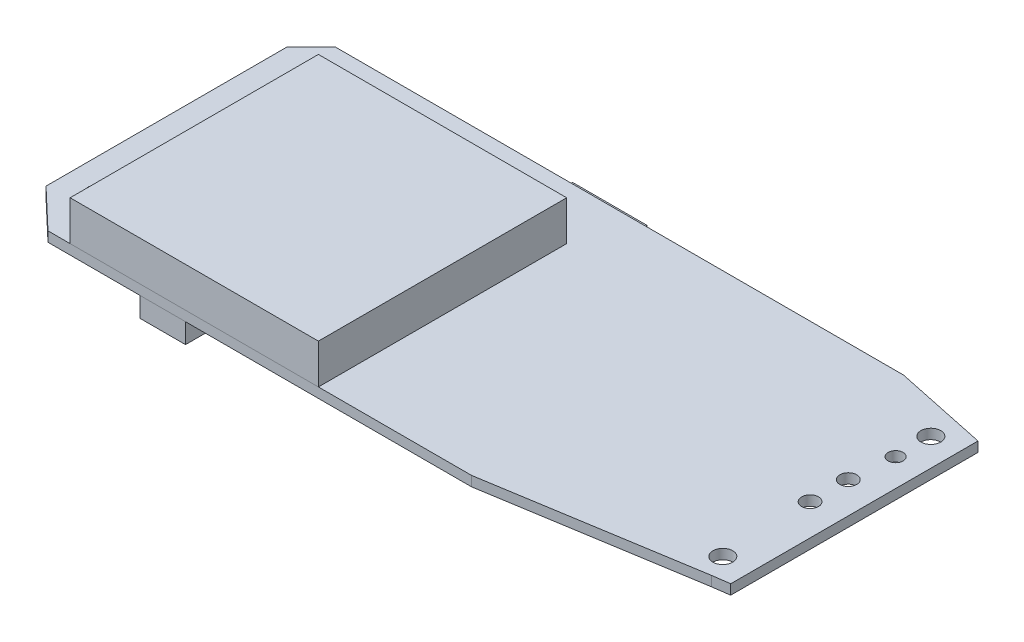
ISO-10303-21;
HEADER;
FILE_DESCRIPTION(('STEP AP214'),'2;1');
FILE_NAME('part.step','',(''),(''),'','','');
FILE_SCHEMA(('AUTOMOTIVE_DESIGN { 1 0 10303 214 1 1 1 1 }'));
ENDSEC;
DATA;
#1=APPLICATION_CONTEXT('core data for automotive mechanical design processes');
#2=APPLICATION_PROTOCOL_DEFINITION('international standard','automotive_design',2000,#1);
#3=PRODUCT_CONTEXT('',#1,'mechanical');
#4=PRODUCT('Part','Part','',(#3));
#5=PRODUCT_RELATED_PRODUCT_CATEGORY('part','',(#4));
#6=PRODUCT_DEFINITION_FORMATION('','',#4);
#7=PRODUCT_DEFINITION_CONTEXT('part definition',#1,'design');
#8=PRODUCT_DEFINITION('design','',#6,#7);
#9=PRODUCT_DEFINITION_SHAPE('','',#8);
#10=(LENGTH_UNIT() NAMED_UNIT(*) SI_UNIT(.MILLI.,.METRE.));
#11=(NAMED_UNIT(*) PLANE_ANGLE_UNIT() SI_UNIT($,.RADIAN.));
#12=(NAMED_UNIT(*) SI_UNIT($,.STERADIAN.) SOLID_ANGLE_UNIT());
#13=UNCERTAINTY_MEASURE_WITH_UNIT(LENGTH_MEASURE(1.E-05),#10,'distance_accuracy_value','');
#14=(GEOMETRIC_REPRESENTATION_CONTEXT(3) GLOBAL_UNCERTAINTY_ASSIGNED_CONTEXT((#13)) GLOBAL_UNIT_ASSIGNED_CONTEXT((#10,
#11,#12)) REPRESENTATION_CONTEXT('',''));
#15=CARTESIAN_POINT('',(0.,0.,0.));
#16=DIRECTION('',(0.,0.,1.));
#17=DIRECTION('',(1.,0.,0.));
#18=AXIS2_PLACEMENT_3D('',#15,#16,#17);
#19=CARTESIAN_POINT('',(-16.725,-2.,15.25));
#20=DIRECTION('',(-1.,0.,0.));
#21=DIRECTION('',(0.,0.,1.));
#22=AXIS2_PLACEMENT_3D('',#19,#20,#21);
#23=PLANE('',#22);
#24=DIRECTION('',(0.,0.,1.));
#25=VECTOR('',#24,1.);
#26=CARTESIAN_POINT('',(-16.725,0.,15.25));
#27=LINE('',#26,#25);
#28=CARTESIAN_POINT('',(-16.725,0.,12.85));
#29=VERTEX_POINT('',#28);
#30=CARTESIAN_POINT('',(-16.725,0.,15.25));
#31=VERTEX_POINT('',#30);
#32=EDGE_CURVE('E109',#29,#31,#27,.T.);
#33=ORIENTED_EDGE('',*,*,#32,.T.);
#34=DIRECTION('',(0.,1.,0.));
#35=VECTOR('',#34,1.);
#36=CARTESIAN_POINT('',(-16.725,-2.,15.25));
#37=LINE('',#36,#35);
#38=CARTESIAN_POINT('',(-16.725,-2.,15.25));
#39=VERTEX_POINT('',#38);
#40=EDGE_CURVE('E12',#39,#31,#37,.T.);
#41=ORIENTED_EDGE('',*,*,#40,.F.);
#42=DIRECTION('',(0.,0.,1.));
#43=VECTOR('',#42,1.);
#44=CARTESIAN_POINT('',(-16.725,-2.,15.25));
#45=LINE('',#44,#43);
#46=CARTESIAN_POINT('',(-16.725,-2.,12.85));
#47=VERTEX_POINT('',#46);
#48=EDGE_CURVE('E97',#47,#39,#45,.T.);
#49=ORIENTED_EDGE('',*,*,#48,.F.);
#50=DIRECTION('',(0.,1.,0.));
#51=VECTOR('',#50,1.);
#52=CARTESIAN_POINT('',(-16.725,-2.,12.85));
#53=LINE('',#52,#51);
#54=EDGE_CURVE('E105',#47,#29,#53,.T.);
#55=ORIENTED_EDGE('',*,*,#54,.T.);
#56=EDGE_LOOP('',(#33,#41,#49,#55));
#57=FACE_BOUND('',#56,.T.);
#58=ADVANCED_FACE('F46',(#57),#23,.F.);
#59=CARTESIAN_POINT('',(-21.285,-2.,15.25));
#60=DIRECTION('',(0.,0.,-1.));
#61=DIRECTION('',(-1.,0.,0.));
#62=AXIS2_PLACEMENT_3D('',#59,#60,#61);
#63=PLANE('',#62);
#64=DIRECTION('',(-1.,0.,0.));
#65=VECTOR('',#64,1.);
#66=CARTESIAN_POINT('',(-21.285,0.,15.25));
#67=LINE('',#66,#65);
#68=CARTESIAN_POINT('',(-21.285,0.,15.25));
#69=VERTEX_POINT('',#68);
#70=EDGE_CURVE('E101',#31,#69,#67,.T.);
#71=ORIENTED_EDGE('',*,*,#70,.T.);
#72=DIRECTION('',(0.,1.,0.));
#73=VECTOR('',#72,1.);
#74=CARTESIAN_POINT('',(-21.285,-2.,15.25));
#75=LINE('',#74,#73);
#76=CARTESIAN_POINT('',(-21.285,-2.,15.25));
#77=VERTEX_POINT('',#76);
#78=EDGE_CURVE('E54',#77,#69,#75,.T.);
#79=ORIENTED_EDGE('',*,*,#78,.F.);
#80=DIRECTION('',(-1.,0.,0.));
#81=VECTOR('',#80,1.);
#82=CARTESIAN_POINT('',(-21.285,-2.,15.25));
#83=LINE('',#82,#81);
#84=EDGE_CURVE('E92',#39,#77,#83,.T.);
#85=ORIENTED_EDGE('',*,*,#84,.F.);
#86=ORIENTED_EDGE('',*,*,#40,.T.);
#87=EDGE_LOOP('',(#71,#79,#85,#86));
#88=FACE_BOUND('',#87,.T.);
#89=ADVANCED_FACE('F100',(#88),#63,.F.);
#90=CARTESIAN_POINT('',(-21.285,-2.,15.25));
#91=DIRECTION('',(1.,0.,0.));
#92=DIRECTION('',(0.,0.,-1.));
#93=AXIS2_PLACEMENT_3D('',#90,#91,#92);
#94=PLANE('',#93);
#95=DIRECTION('',(0.,0.,-1.));
#96=VECTOR('',#95,1.);
#97=CARTESIAN_POINT('',(-21.285,0.,15.25));
#98=LINE('',#97,#96);
#99=CARTESIAN_POINT('',(-21.285,0.,12.85));
#100=VERTEX_POINT('',#99);
#101=EDGE_CURVE('E79',#69,#100,#98,.T.);
#102=ORIENTED_EDGE('',*,*,#101,.T.);
#103=DIRECTION('',(0.,1.,0.));
#104=VECTOR('',#103,1.);
#105=CARTESIAN_POINT('',(-21.285,-2.,12.85));
#106=LINE('',#105,#104);
#107=CARTESIAN_POINT('',(-21.285,-2.,12.85));
#108=VERTEX_POINT('',#107);
#109=EDGE_CURVE('E102',#108,#100,#106,.T.);
#110=ORIENTED_EDGE('',*,*,#109,.F.);
#111=DIRECTION('',(0.,0.,-1.));
#112=VECTOR('',#111,1.);
#113=CARTESIAN_POINT('',(-21.285,-2.,15.25));
#114=LINE('',#113,#112);
#115=EDGE_CURVE('E95',#77,#108,#114,.T.);
#116=ORIENTED_EDGE('',*,*,#115,.F.);
#117=ORIENTED_EDGE('',*,*,#78,.T.);
#118=EDGE_LOOP('',(#102,#110,#116,#117));
#119=FACE_BOUND('',#118,.T.);
#120=ADVANCED_FACE('F103',(#119),#94,.F.);
#121=CARTESIAN_POINT('',(-21.285,-2.,12.85));
#122=DIRECTION('',(0.,0.,1.));
#123=DIRECTION('',(1.,0.,0.));
#124=AXIS2_PLACEMENT_3D('',#121,#122,#123);
#125=PLANE('',#124);
#126=DIRECTION('',(1.,0.,0.));
#127=VECTOR('',#126,1.);
#128=CARTESIAN_POINT('',(-21.285,0.,12.85));
#129=LINE('',#128,#127);
#130=EDGE_CURVE('E85',#100,#29,#129,.T.);
#131=ORIENTED_EDGE('',*,*,#130,.T.);
#132=ORIENTED_EDGE('',*,*,#54,.F.);
#133=DIRECTION('',(1.,0.,0.));
#134=VECTOR('',#133,1.);
#135=CARTESIAN_POINT('',(-21.285,-2.,12.85));
#136=LINE('',#135,#134);
#137=EDGE_CURVE('E62',#108,#47,#136,.T.);
#138=ORIENTED_EDGE('',*,*,#137,.F.);
#139=ORIENTED_EDGE('',*,*,#109,.T.);
#140=EDGE_LOOP('',(#131,#132,#138,#139));
#141=FACE_BOUND('',#140,.T.);
#142=ADVANCED_FACE('F116',(#141),#125,.F.);
#143=CARTESIAN_POINT('',(0.,-2.,0.));
#144=DIRECTION('',(0.,-1.,0.));
#145=DIRECTION('',(0.,0.,-1.));
#146=AXIS2_PLACEMENT_3D('',#143,#144,#145);
#147=PLANE('',#146);
#148=ORIENTED_EDGE('',*,*,#48,.T.);
#149=ORIENTED_EDGE('',*,*,#84,.T.);
#150=ORIENTED_EDGE('',*,*,#115,.T.);
#151=ORIENTED_EDGE('',*,*,#137,.T.);
#152=EDGE_LOOP('',(#148,#149,#150,#151));
#153=FACE_BOUND('',#152,.T.);
#154=ADVANCED_FACE('F93',(#153),#147,.T.);
#155=CARTESIAN_POINT('',(0.,0.,0.));
#156=DIRECTION('',(0.,-1.,0.));
#157=DIRECTION('',(0.,0.,-1.));
#158=AXIS2_PLACEMENT_3D('',#155,#156,#157);
#159=PLANE('',#158);
#160=ORIENTED_EDGE('',*,*,#32,.F.);
#161=ORIENTED_EDGE('',*,*,#130,.F.);
#162=ORIENTED_EDGE('',*,*,#101,.F.);
#163=ORIENTED_EDGE('',*,*,#70,.F.);
#164=EDGE_LOOP('',(#160,#161,#162,#163));
#165=FACE_BOUND('',#164,.T.);
#166=ADVANCED_FACE('F119',(#165),#159,.F.);
#167=CLOSED_SHELL('',(#58,#89,#120,#142,#154,#166));
#168=MANIFOLD_SOLID_BREP('B2',#167);
#169=CARTESIAN_POINT('',(-1.87499999999999,-2.5,-11.09));
#170=DIRECTION('',(-1.,0.,0.));
#171=DIRECTION('',(0.,0.,1.));
#172=AXIS2_PLACEMENT_3D('',#169,#170,#171);
#173=PLANE('',#172);
#174=DIRECTION('',(0.,0.,1.));
#175=VECTOR('',#174,1.);
#176=CARTESIAN_POINT('',(-1.87499999999999,0.,-11.09));
#177=LINE('',#176,#175);
#178=CARTESIAN_POINT('',(-1.87499999999999,0.,-16.39));
#179=VERTEX_POINT('',#178);
#180=CARTESIAN_POINT('',(-1.87499999999999,0.,-11.09));
#181=VERTEX_POINT('',#180);
#182=EDGE_CURVE('E243',#179,#181,#177,.T.);
#183=ORIENTED_EDGE('',*,*,#182,.T.);
#184=DIRECTION('',(0.,1.,0.));
#185=VECTOR('',#184,1.);
#186=CARTESIAN_POINT('',(-1.87499999999999,-2.5,-11.09));
#187=LINE('',#186,#185);
#188=CARTESIAN_POINT('',(-1.87499999999999,-2.5,-11.09));
#189=VERTEX_POINT('',#188);
#190=EDGE_CURVE('E44',#189,#181,#187,.T.);
#191=ORIENTED_EDGE('',*,*,#190,.F.);
#192=DIRECTION('',(0.,0.,1.));
#193=VECTOR('',#192,1.);
#194=CARTESIAN_POINT('',(-1.87499999999999,-2.5,-11.09));
#195=LINE('',#194,#193);
#196=CARTESIAN_POINT('',(-1.87499999999999,-2.5,-16.39));
#197=VERTEX_POINT('',#196);
#198=EDGE_CURVE('E231',#197,#189,#195,.T.);
#199=ORIENTED_EDGE('',*,*,#198,.F.);
#200=DIRECTION('',(0.,1.,0.));
#201=VECTOR('',#200,1.);
#202=CARTESIAN_POINT('',(-1.87499999999999,-2.5,-16.39));
#203=LINE('',#202,#201);
#204=EDGE_CURVE('E239',#197,#179,#203,.T.);
#205=ORIENTED_EDGE('',*,*,#204,.T.);
#206=EDGE_LOOP('',(#183,#191,#199,#205));
#207=FACE_BOUND('',#206,.T.);
#208=ADVANCED_FACE('F180',(#207),#173,.F.);
#209=CARTESIAN_POINT('',(-9.37499999999999,-2.5,-11.09));
#210=DIRECTION('',(0.,0.,-1.));
#211=DIRECTION('',(-1.,0.,0.));
#212=AXIS2_PLACEMENT_3D('',#209,#210,#211);
#213=PLANE('',#212);
#214=DIRECTION('',(-1.,0.,0.));
#215=VECTOR('',#214,1.);
#216=CARTESIAN_POINT('',(-9.37499999999999,0.,-11.09));
#217=LINE('',#216,#215);
#218=CARTESIAN_POINT('',(-9.37499999999999,0.,-11.09));
#219=VERTEX_POINT('',#218);
#220=EDGE_CURVE('E235',#181,#219,#217,.T.);
#221=ORIENTED_EDGE('',*,*,#220,.T.);
#222=DIRECTION('',(0.,1.,0.));
#223=VECTOR('',#222,1.);
#224=CARTESIAN_POINT('',(-9.37499999999999,-2.5,-11.09));
#225=LINE('',#224,#223);
#226=CARTESIAN_POINT('',(-9.37499999999999,-2.5,-11.09));
#227=VERTEX_POINT('',#226);
#228=EDGE_CURVE('E188',#227,#219,#225,.T.);
#229=ORIENTED_EDGE('',*,*,#228,.F.);
#230=DIRECTION('',(-1.,0.,0.));
#231=VECTOR('',#230,1.);
#232=CARTESIAN_POINT('',(-9.37499999999999,-2.5,-11.09));
#233=LINE('',#232,#231);
#234=EDGE_CURVE('E226',#189,#227,#233,.T.);
#235=ORIENTED_EDGE('',*,*,#234,.F.);
#236=ORIENTED_EDGE('',*,*,#190,.T.);
#237=EDGE_LOOP('',(#221,#229,#235,#236));
#238=FACE_BOUND('',#237,.T.);
#239=ADVANCED_FACE('F234',(#238),#213,.F.);
#240=CARTESIAN_POINT('',(-9.37499999999999,-2.5,-11.09));
#241=DIRECTION('',(1.,0.,0.));
#242=DIRECTION('',(0.,0.,-1.));
#243=AXIS2_PLACEMENT_3D('',#240,#241,#242);
#244=PLANE('',#243);
#245=DIRECTION('',(0.,0.,-1.));
#246=VECTOR('',#245,1.);
#247=CARTESIAN_POINT('',(-9.37499999999999,0.,-11.09));
#248=LINE('',#247,#246);
#249=CARTESIAN_POINT('',(-9.37499999999999,0.,-16.39));
#250=VERTEX_POINT('',#249);
#251=EDGE_CURVE('E213',#219,#250,#248,.T.);
#252=ORIENTED_EDGE('',*,*,#251,.T.);
#253=DIRECTION('',(0.,1.,0.));
#254=VECTOR('',#253,1.);
#255=CARTESIAN_POINT('',(-9.37499999999999,-2.5,-16.39));
#256=LINE('',#255,#254);
#257=CARTESIAN_POINT('',(-9.37499999999999,-2.5,-16.39));
#258=VERTEX_POINT('',#257);
#259=EDGE_CURVE('E236',#258,#250,#256,.T.);
#260=ORIENTED_EDGE('',*,*,#259,.F.);
#261=DIRECTION('',(0.,0.,-1.));
#262=VECTOR('',#261,1.);
#263=CARTESIAN_POINT('',(-9.37499999999999,-2.5,-11.09));
#264=LINE('',#263,#262);
#265=EDGE_CURVE('E229',#227,#258,#264,.T.);
#266=ORIENTED_EDGE('',*,*,#265,.F.);
#267=ORIENTED_EDGE('',*,*,#228,.T.);
#268=EDGE_LOOP('',(#252,#260,#266,#267));
#269=FACE_BOUND('',#268,.T.);
#270=ADVANCED_FACE('F237',(#269),#244,.F.);
#271=CARTESIAN_POINT('',(-9.37499999999999,-2.5,-16.39));
#272=DIRECTION('',(0.,0.,1.));
#273=DIRECTION('',(1.,0.,0.));
#274=AXIS2_PLACEMENT_3D('',#271,#272,#273);
#275=PLANE('',#274);
#276=DIRECTION('',(1.,0.,0.));
#277=VECTOR('',#276,1.);
#278=CARTESIAN_POINT('',(-9.37499999999999,0.,-16.39));
#279=LINE('',#278,#277);
#280=EDGE_CURVE('E219',#250,#179,#279,.T.);
#281=ORIENTED_EDGE('',*,*,#280,.T.);
#282=ORIENTED_EDGE('',*,*,#204,.F.);
#283=DIRECTION('',(1.,0.,0.));
#284=VECTOR('',#283,1.);
#285=CARTESIAN_POINT('',(-9.37499999999999,-2.5,-16.39));
#286=LINE('',#285,#284);
#287=EDGE_CURVE('E196',#258,#197,#286,.T.);
#288=ORIENTED_EDGE('',*,*,#287,.F.);
#289=ORIENTED_EDGE('',*,*,#259,.T.);
#290=EDGE_LOOP('',(#281,#282,#288,#289));
#291=FACE_BOUND('',#290,.T.);
#292=ADVANCED_FACE('F250',(#291),#275,.F.);
#293=CARTESIAN_POINT('',(0.,-2.5,0.));
#294=DIRECTION('',(0.,-1.,0.));
#295=DIRECTION('',(0.,0.,-1.));
#296=AXIS2_PLACEMENT_3D('',#293,#294,#295);
#297=PLANE('',#296);
#298=ORIENTED_EDGE('',*,*,#198,.T.);
#299=ORIENTED_EDGE('',*,*,#234,.T.);
#300=ORIENTED_EDGE('',*,*,#265,.T.);
#301=ORIENTED_EDGE('',*,*,#287,.T.);
#302=EDGE_LOOP('',(#298,#299,#300,#301));
#303=FACE_BOUND('',#302,.T.);
#304=ADVANCED_FACE('F227',(#303),#297,.T.);
#305=CARTESIAN_POINT('',(0.,0.,0.));
#306=DIRECTION('',(0.,-1.,0.));
#307=DIRECTION('',(0.,0.,-1.));
#308=AXIS2_PLACEMENT_3D('',#305,#306,#307);
#309=PLANE('',#308);
#310=ORIENTED_EDGE('',*,*,#182,.F.);
#311=ORIENTED_EDGE('',*,*,#280,.F.);
#312=ORIENTED_EDGE('',*,*,#251,.F.);
#313=ORIENTED_EDGE('',*,*,#220,.F.);
#314=EDGE_LOOP('',(#310,#311,#312,#313));
#315=FACE_BOUND('',#314,.T.);
#316=ADVANCED_FACE('F253',(#315),#309,.F.);
#317=CLOSED_SHELL('',(#208,#239,#270,#292,#304,#316));
#318=MANIFOLD_SOLID_BREP('B6',#317);
#319=CARTESIAN_POINT('',(-11.545,-1.5,1.15000000000001));
#320=DIRECTION('',(-1.,0.,0.));
#321=DIRECTION('',(0.,0.,1.));
#322=AXIS2_PLACEMENT_3D('',#319,#320,#321);
#323=PLANE('',#322);
#324=DIRECTION('',(0.,0.,1.));
#325=VECTOR('',#324,1.);
#326=CARTESIAN_POINT('',(-11.545,0.,1.15000000000001));
#327=LINE('',#326,#325);
#328=CARTESIAN_POINT('',(-11.545,0.,-15.25));
#329=VERTEX_POINT('',#328);
#330=CARTESIAN_POINT('',(-11.545,0.,1.15000000000001));
#331=VERTEX_POINT('',#330);
#332=EDGE_CURVE('E377',#329,#331,#327,.T.);
#333=ORIENTED_EDGE('',*,*,#332,.T.);
#334=DIRECTION('',(0.,1.,0.));
#335=VECTOR('',#334,1.);
#336=CARTESIAN_POINT('',(-11.545,-1.5,1.15000000000001));
#337=LINE('',#336,#335);
#338=CARTESIAN_POINT('',(-11.545,-1.5,1.15000000000001));
#339=VERTEX_POINT('',#338);
#340=EDGE_CURVE('E178',#339,#331,#337,.T.);
#341=ORIENTED_EDGE('',*,*,#340,.F.);
#342=DIRECTION('',(0.,0.,1.));
#343=VECTOR('',#342,1.);
#344=CARTESIAN_POINT('',(-11.545,-1.5,1.15000000000001));
#345=LINE('',#344,#343);
#346=CARTESIAN_POINT('',(-11.545,-1.5,-15.25));
#347=VERTEX_POINT('',#346);
#348=EDGE_CURVE('E365',#347,#339,#345,.T.);
#349=ORIENTED_EDGE('',*,*,#348,.F.);
#350=DIRECTION('',(0.,1.,0.));
#351=VECTOR('',#350,1.);
#352=CARTESIAN_POINT('',(-11.545,-1.5,-15.25));
#353=LINE('',#352,#351);
#354=EDGE_CURVE('E373',#347,#329,#353,.T.);
#355=ORIENTED_EDGE('',*,*,#354,.T.);
#356=EDGE_LOOP('',(#333,#341,#349,#355));
#357=FACE_BOUND('',#356,.T.);
#358=ADVANCED_FACE('F314',(#357),#323,.F.);
#359=CARTESIAN_POINT('',(-27.395,-1.5,1.15));
#360=DIRECTION('',(0.,0.,-1.));
#361=DIRECTION('',(-1.,0.,0.));
#362=AXIS2_PLACEMENT_3D('',#359,#360,#361);
#363=PLANE('',#362);
#364=DIRECTION('',(-1.,0.,0.));
#365=VECTOR('',#364,1.);
#366=CARTESIAN_POINT('',(-27.395,0.,1.15));
#367=LINE('',#366,#365);
#368=CARTESIAN_POINT('',(-27.395,0.,1.15));
#369=VERTEX_POINT('',#368);
#370=EDGE_CURVE('E369',#331,#369,#367,.T.);
#371=ORIENTED_EDGE('',*,*,#370,.T.);
#372=DIRECTION('',(0.,1.,0.));
#373=VECTOR('',#372,1.);
#374=CARTESIAN_POINT('',(-27.395,-1.5,1.15));
#375=LINE('',#374,#373);
#376=CARTESIAN_POINT('',(-27.395,-1.5,1.15));
#377=VERTEX_POINT('',#376);
#378=EDGE_CURVE('E322',#377,#369,#375,.T.);
#379=ORIENTED_EDGE('',*,*,#378,.F.);
#380=DIRECTION('',(-1.,0.,0.));
#381=VECTOR('',#380,1.);
#382=CARTESIAN_POINT('',(-27.395,-1.5,1.15));
#383=LINE('',#382,#381);
#384=EDGE_CURVE('E360',#339,#377,#383,.T.);
#385=ORIENTED_EDGE('',*,*,#384,.F.);
#386=ORIENTED_EDGE('',*,*,#340,.T.);
#387=EDGE_LOOP('',(#371,#379,#385,#386));
#388=FACE_BOUND('',#387,.T.);
#389=ADVANCED_FACE('F368',(#388),#363,.F.);
#390=CARTESIAN_POINT('',(-27.395,-1.5,1.15));
#391=DIRECTION('',(1.,0.,0.));
#392=DIRECTION('',(0.,0.,-1.));
#393=AXIS2_PLACEMENT_3D('',#390,#391,#392);
#394=PLANE('',#393);
#395=DIRECTION('',(0.,0.,-1.));
#396=VECTOR('',#395,1.);
#397=CARTESIAN_POINT('',(-27.395,0.,1.15));
#398=LINE('',#397,#396);
#399=CARTESIAN_POINT('',(-27.395,0.,-15.25));
#400=VERTEX_POINT('',#399);
#401=EDGE_CURVE('E347',#369,#400,#398,.T.);
#402=ORIENTED_EDGE('',*,*,#401,.T.);
#403=DIRECTION('',(0.,1.,0.));
#404=VECTOR('',#403,1.);
#405=CARTESIAN_POINT('',(-27.395,-1.5,-15.25));
#406=LINE('',#405,#404);
#407=CARTESIAN_POINT('',(-27.395,-1.5,-15.25));
#408=VERTEX_POINT('',#407);
#409=EDGE_CURVE('E370',#408,#400,#406,.T.);
#410=ORIENTED_EDGE('',*,*,#409,.F.);
#411=DIRECTION('',(0.,0.,-1.));
#412=VECTOR('',#411,1.);
#413=CARTESIAN_POINT('',(-27.395,-1.5,1.15));
#414=LINE('',#413,#412);
#415=EDGE_CURVE('E363',#377,#408,#414,.T.);
#416=ORIENTED_EDGE('',*,*,#415,.F.);
#417=ORIENTED_EDGE('',*,*,#378,.T.);
#418=EDGE_LOOP('',(#402,#410,#416,#417));
#419=FACE_BOUND('',#418,.T.);
#420=ADVANCED_FACE('F371',(#419),#394,.F.);
#421=CARTESIAN_POINT('',(-27.395,-1.5,-15.25));
#422=DIRECTION('',(0.,0.,1.));
#423=DIRECTION('',(1.,0.,0.));
#424=AXIS2_PLACEMENT_3D('',#421,#422,#423);
#425=PLANE('',#424);
#426=DIRECTION('',(1.,0.,0.));
#427=VECTOR('',#426,1.);
#428=CARTESIAN_POINT('',(-27.395,0.,-15.25));
#429=LINE('',#428,#427);
#430=EDGE_CURVE('E353',#400,#329,#429,.T.);
#431=ORIENTED_EDGE('',*,*,#430,.T.);
#432=ORIENTED_EDGE('',*,*,#354,.F.);
#433=DIRECTION('',(1.,0.,0.));
#434=VECTOR('',#433,1.);
#435=CARTESIAN_POINT('',(-27.395,-1.5,-15.25));
#436=LINE('',#435,#434);
#437=EDGE_CURVE('E330',#408,#347,#436,.T.);
#438=ORIENTED_EDGE('',*,*,#437,.F.);
#439=ORIENTED_EDGE('',*,*,#409,.T.);
#440=EDGE_LOOP('',(#431,#432,#438,#439));
#441=FACE_BOUND('',#440,.T.);
#442=ADVANCED_FACE('F384',(#441),#425,.F.);
#443=CARTESIAN_POINT('',(0.,-1.5,0.));
#444=DIRECTION('',(0.,-1.,0.));
#445=DIRECTION('',(0.,0.,-1.));
#446=AXIS2_PLACEMENT_3D('',#443,#444,#445);
#447=PLANE('',#446);
#448=ORIENTED_EDGE('',*,*,#348,.T.);
#449=ORIENTED_EDGE('',*,*,#384,.T.);
#450=ORIENTED_EDGE('',*,*,#415,.T.);
#451=ORIENTED_EDGE('',*,*,#437,.T.);
#452=EDGE_LOOP('',(#448,#449,#450,#451));
#453=FACE_BOUND('',#452,.T.);
#454=ADVANCED_FACE('F361',(#453),#447,.T.);
#455=CARTESIAN_POINT('',(0.,0.,0.));
#456=DIRECTION('',(0.,-1.,0.));
#457=DIRECTION('',(0.,0.,-1.));
#458=AXIS2_PLACEMENT_3D('',#455,#456,#457);
#459=PLANE('',#458);
#460=ORIENTED_EDGE('',*,*,#332,.F.);
#461=ORIENTED_EDGE('',*,*,#430,.F.);
#462=ORIENTED_EDGE('',*,*,#401,.F.);
#463=ORIENTED_EDGE('',*,*,#370,.F.);
#464=EDGE_LOOP('',(#460,#461,#462,#463));
#465=FACE_BOUND('',#464,.T.);
#466=ADVANCED_FACE('F387',(#465),#459,.F.);
#467=CLOSED_SHELL('',(#358,#389,#420,#442,#454,#466));
#468=MANIFOLD_SOLID_BREP('B38',#467);
#469=CARTESIAN_POINT('',(-3.34499999999999,5.,-9.75));
#470=DIRECTION('',(-1.,0.,0.));
#471=DIRECTION('',(0.,0.,1.));
#472=AXIS2_PLACEMENT_3D('',#469,#470,#471);
#473=PLANE('',#472);
#474=DIRECTION('',(0.,0.,-1.));
#475=VECTOR('',#474,1.);
#476=CARTESIAN_POINT('',(-3.34499999999999,1.,-9.75));
#477=LINE('',#476,#475);
#478=CARTESIAN_POINT('',(-3.34499999999999,1.,15.25));
#479=VERTEX_POINT('',#478);
#480=CARTESIAN_POINT('',(-3.34499999999999,1.,-9.75));
#481=VERTEX_POINT('',#480);
#482=EDGE_CURVE('E509',#479,#481,#477,.T.);
#483=ORIENTED_EDGE('',*,*,#482,.T.);
#484=DIRECTION('',(0.,-1.,0.));
#485=VECTOR('',#484,1.);
#486=CARTESIAN_POINT('',(-3.34499999999999,5.,-9.75));
#487=LINE('',#486,#485);
#488=CARTESIAN_POINT('',(-3.34499999999999,5.,-9.75));
#489=VERTEX_POINT('',#488);
#490=EDGE_CURVE('E312',#489,#481,#487,.T.);
#491=ORIENTED_EDGE('',*,*,#490,.F.);
#492=DIRECTION('',(0.,0.,-1.));
#493=VECTOR('',#492,1.);
#494=CARTESIAN_POINT('',(-3.34499999999999,5.,-9.75));
#495=LINE('',#494,#493);
#496=CARTESIAN_POINT('',(-3.34499999999999,5.,15.25));
#497=VERTEX_POINT('',#496);
#498=EDGE_CURVE('E497',#497,#489,#495,.T.);
#499=ORIENTED_EDGE('',*,*,#498,.F.);
#500=DIRECTION('',(0.,-1.,0.));
#501=VECTOR('',#500,1.);
#502=CARTESIAN_POINT('',(-3.34499999999999,5.,15.25));
#503=LINE('',#502,#501);
#504=EDGE_CURVE('E505',#497,#479,#503,.T.);
#505=ORIENTED_EDGE('',*,*,#504,.T.);
#506=EDGE_LOOP('',(#483,#491,#499,#505));
#507=FACE_BOUND('',#506,.T.);
#508=ADVANCED_FACE('F446',(#507),#473,.F.);
#509=CARTESIAN_POINT('',(-28.345,5.,-9.75));
#510=DIRECTION('',(0.,0.,1.));
#511=DIRECTION('',(1.,0.,0.));
#512=AXIS2_PLACEMENT_3D('',#509,#510,#511);
#513=PLANE('',#512);
#514=DIRECTION('',(-1.,0.,0.));
#515=VECTOR('',#514,1.);
#516=CARTESIAN_POINT('',(-28.345,1.,-9.75));
#517=LINE('',#516,#515);
#518=CARTESIAN_POINT('',(-28.345,1.,-9.75));
#519=VERTEX_POINT('',#518);
#520=EDGE_CURVE('E501',#481,#519,#517,.T.);
#521=ORIENTED_EDGE('',*,*,#520,.T.);
#522=DIRECTION('',(0.,-1.,0.));
#523=VECTOR('',#522,1.);
#524=CARTESIAN_POINT('',(-28.345,5.,-9.75));
#525=LINE('',#524,#523);
#526=CARTESIAN_POINT('',(-28.345,5.,-9.75));
#527=VERTEX_POINT('',#526);
#528=EDGE_CURVE('E454',#527,#519,#525,.T.);
#529=ORIENTED_EDGE('',*,*,#528,.F.);
#530=DIRECTION('',(-1.,0.,0.));
#531=VECTOR('',#530,1.);
#532=CARTESIAN_POINT('',(-28.345,5.,-9.75));
#533=LINE('',#532,#531);
#534=EDGE_CURVE('E492',#489,#527,#533,.T.);
#535=ORIENTED_EDGE('',*,*,#534,.F.);
#536=ORIENTED_EDGE('',*,*,#490,.T.);
#537=EDGE_LOOP('',(#521,#529,#535,#536));
#538=FACE_BOUND('',#537,.T.);
#539=ADVANCED_FACE('F500',(#538),#513,.F.);
#540=CARTESIAN_POINT('',(-28.345,5.,-9.75));
#541=DIRECTION('',(1.,0.,0.));
#542=DIRECTION('',(0.,0.,-1.));
#543=AXIS2_PLACEMENT_3D('',#540,#541,#542);
#544=PLANE('',#543);
#545=DIRECTION('',(0.,0.,1.));
#546=VECTOR('',#545,1.);
#547=CARTESIAN_POINT('',(-28.345,1.,-9.75));
#548=LINE('',#547,#546);
#549=CARTESIAN_POINT('',(-28.345,1.,15.25));
#550=VERTEX_POINT('',#549);
#551=EDGE_CURVE('E479',#519,#550,#548,.T.);
#552=ORIENTED_EDGE('',*,*,#551,.T.);
#553=DIRECTION('',(0.,-1.,0.));
#554=VECTOR('',#553,1.);
#555=CARTESIAN_POINT('',(-28.345,5.,15.25));
#556=LINE('',#555,#554);
#557=CARTESIAN_POINT('',(-28.345,5.,15.25));
#558=VERTEX_POINT('',#557);
#559=EDGE_CURVE('E502',#558,#550,#556,.T.);
#560=ORIENTED_EDGE('',*,*,#559,.F.);
#561=DIRECTION('',(0.,0.,1.));
#562=VECTOR('',#561,1.);
#563=CARTESIAN_POINT('',(-28.345,5.,-9.75));
#564=LINE('',#563,#562);
#565=EDGE_CURVE('E495',#527,#558,#564,.T.);
#566=ORIENTED_EDGE('',*,*,#565,.F.);
#567=ORIENTED_EDGE('',*,*,#528,.T.);
#568=EDGE_LOOP('',(#552,#560,#566,#567));
#569=FACE_BOUND('',#568,.T.);
#570=ADVANCED_FACE('F503',(#569),#544,.F.);
#571=CARTESIAN_POINT('',(-28.345,5.,15.25));
#572=DIRECTION('',(0.,0.,-1.));
#573=DIRECTION('',(-1.,0.,0.));
#574=AXIS2_PLACEMENT_3D('',#571,#572,#573);
#575=PLANE('',#574);
#576=DIRECTION('',(1.,0.,0.));
#577=VECTOR('',#576,1.);
#578=CARTESIAN_POINT('',(-28.345,1.,15.25));
#579=LINE('',#578,#577);
#580=EDGE_CURVE('E485',#550,#479,#579,.T.);
#581=ORIENTED_EDGE('',*,*,#580,.T.);
#582=ORIENTED_EDGE('',*,*,#504,.F.);
#583=DIRECTION('',(1.,0.,0.));
#584=VECTOR('',#583,1.);
#585=CARTESIAN_POINT('',(-28.345,5.,15.25));
#586=LINE('',#585,#584);
#587=EDGE_CURVE('E462',#558,#497,#586,.T.);
#588=ORIENTED_EDGE('',*,*,#587,.F.);
#589=ORIENTED_EDGE('',*,*,#559,.T.);
#590=EDGE_LOOP('',(#581,#582,#588,#589));
#591=FACE_BOUND('',#590,.T.);
#592=ADVANCED_FACE('F516',(#591),#575,.F.);
#593=CARTESIAN_POINT('',(0.,5.,0.));
#594=DIRECTION('',(0.,1.,0.));
#595=DIRECTION('',(0.,0.,1.));
#596=AXIS2_PLACEMENT_3D('',#593,#594,#595);
#597=PLANE('',#596);
#598=ORIENTED_EDGE('',*,*,#498,.T.);
#599=ORIENTED_EDGE('',*,*,#534,.T.);
#600=ORIENTED_EDGE('',*,*,#565,.T.);
#601=ORIENTED_EDGE('',*,*,#587,.T.);
#602=EDGE_LOOP('',(#598,#599,#600,#601));
#603=FACE_BOUND('',#602,.T.);
#604=ADVANCED_FACE('F493',(#603),#597,.T.);
#605=CARTESIAN_POINT('',(0.,1.,0.));
#606=DIRECTION('',(0.,1.,0.));
#607=DIRECTION('',(0.,0.,1.));
#608=AXIS2_PLACEMENT_3D('',#605,#606,#607);
#609=PLANE('',#608);
#610=ORIENTED_EDGE('',*,*,#482,.F.);
#611=ORIENTED_EDGE('',*,*,#580,.F.);
#612=ORIENTED_EDGE('',*,*,#551,.F.);
#613=ORIENTED_EDGE('',*,*,#520,.F.);
#614=EDGE_LOOP('',(#610,#611,#612,#613));
#615=FACE_BOUND('',#614,.T.);
#616=ADVANCED_FACE('F519',(#615),#609,.F.);
#617=CLOSED_SHELL('',(#508,#539,#570,#592,#604,#616));
#618=MANIFOLD_SOLID_BREP('B172',#617);
#619=CARTESIAN_POINT('',(0.,1.,0.));
#620=DIRECTION('',(0.,1.,0.));
#621=DIRECTION('',(0.,0.,1.));
#622=AXIS2_PLACEMENT_3D('',#619,#620,#621);
#623=PLANE('',#622);
#624=CARTESIAN_POINT('',(-31.375,1.,9.43000000000001));
#625=DIRECTION('',(0.,1.,0.));
#626=DIRECTION('',(0.,0.,1.));
#627=AXIS2_PLACEMENT_3D('',#624,#625,#626);
#628=CIRCLE('',#627,1.);
#629=CARTESIAN_POINT('',(-31.375,1.,10.43));
#630=VERTEX_POINT('',#629);
#631=EDGE_CURVE('E758',#630,#630,#628,.T.);
#632=ORIENTED_EDGE('',*,*,#631,.F.);
#633=EDGE_LOOP('',(#632));
#634=FACE_BOUND('',#633,.T.);
#635=CARTESIAN_POINT('',(31.415,1.,-3.35046212645426));
#636=DIRECTION('',(0.,1.,0.));
#637=DIRECTION('',(0.,0.,1.));
#638=AXIS2_PLACEMENT_3D('',#635,#636,#637);
#639=CIRCLE('',#638,0.85);
#640=CARTESIAN_POINT('',(31.415,1.,-2.50046212645426));
#641=VERTEX_POINT('',#640);
#642=EDGE_CURVE('E746',#641,#641,#639,.T.);
#643=ORIENTED_EDGE('',*,*,#642,.F.);
#644=EDGE_LOOP('',(#643));
#645=FACE_BOUND('',#644,.T.);
#646=CARTESIAN_POINT('',(31.795,1.,9.66953787354574));
#647=DIRECTION('',(0.,1.,0.));
#648=DIRECTION('',(0.,0.,1.));
#649=AXIS2_PLACEMENT_3D('',#646,#647,#648);
#650=CIRCLE('',#649,0.999999999999998);
#651=CARTESIAN_POINT('',(31.795,1.,10.6695378735457));
#652=VERTEX_POINT('',#651);
#653=EDGE_CURVE('E734',#652,#652,#650,.T.);
#654=ORIENTED_EDGE('',*,*,#653,.F.);
#655=EDGE_LOOP('',(#654));
#656=FACE_BOUND('',#655,.T.);
#657=DIRECTION('',(-0.707106781186547,0.,0.707106781186548));
#658=VECTOR('',#657,1.);
#659=CARTESIAN_POINT('',(-34.575,1.,-12.85));
#660=LINE('',#659,#658);
#661=CARTESIAN_POINT('',(-32.175,1.,-15.25));
#662=VERTEX_POINT('',#661);
#663=CARTESIAN_POINT('',(-34.575,1.,-12.85));
#664=VERTEX_POINT('',#663);
#665=EDGE_CURVE('E689',#662,#664,#660,.T.);
#666=ORIENTED_EDGE('',*,*,#665,.T.);
#667=DIRECTION('',(0.,0.,1.));
#668=VECTOR('',#667,1.);
#669=CARTESIAN_POINT('',(-34.575,1.,11.45));
#670=LINE('',#669,#668);
#671=CARTESIAN_POINT('',(-34.575,1.,11.45));
#672=VERTEX_POINT('',#671);
#673=EDGE_CURVE('E632',#664,#672,#670,.T.);
#674=ORIENTED_EDGE('',*,*,#673,.T.);
#675=DIRECTION('',(0.724999433594415,0.,0.688749461914692));
#676=VECTOR('',#675,1.);
#677=CARTESIAN_POINT('',(-30.575,1.,15.25));
#678=LINE('',#677,#676);
#679=CARTESIAN_POINT('',(-30.575,1.,15.25));
#680=VERTEX_POINT('',#679);
#681=EDGE_CURVE('E707',#672,#680,#678,.T.);
#682=ORIENTED_EDGE('',*,*,#681,.T.);
#683=DIRECTION('',(1.,0.,0.));
#684=VECTOR('',#683,1.);
#685=CARTESIAN_POINT('',(12.075,1.,15.25));
#686=LINE('',#685,#684);
#687=CARTESIAN_POINT('',(12.075,1.,15.25));
#688=VERTEX_POINT('',#687);
#689=EDGE_CURVE('E724',#680,#688,#686,.T.);
#690=ORIENTED_EDGE('',*,*,#689,.T.);
#691=DIRECTION('',(0.987202583394544,0.,-0.159471186548349));
#692=VECTOR('',#691,1.);
#693=CARTESIAN_POINT('',(32.875,1.,11.89));
#694=LINE('',#693,#692);
#695=CARTESIAN_POINT('',(32.875,1.,11.89));
#696=VERTEX_POINT('',#695);
#697=EDGE_CURVE('E723',#688,#696,#694,.T.);
#698=ORIENTED_EDGE('',*,*,#697,.T.);
#699=DIRECTION('',(0.990181134059172,0.,-0.139790277749532));
#700=VECTOR('',#699,1.);
#701=CARTESIAN_POINT('',(34.575,1.,11.65));
#702=LINE('',#701,#700);
#703=CARTESIAN_POINT('',(34.575,1.,11.65));
#704=VERTEX_POINT('',#703);
#705=EDGE_CURVE('E654',#696,#704,#702,.T.);
#706=ORIENTED_EDGE('',*,*,#705,.T.);
#707=DIRECTION('',(0.,0.,-1.));
#708=VECTOR('',#707,1.);
#709=CARTESIAN_POINT('',(34.575,1.,-13.25));
#710=LINE('',#709,#708);
#711=CARTESIAN_POINT('',(34.575,1.,-13.25));
#712=VERTEX_POINT('',#711);
#713=EDGE_CURVE('E648',#704,#712,#710,.T.);
#714=ORIENTED_EDGE('',*,*,#713,.T.);
#715=DIRECTION('',(-0.978549784986749,0.,-0.206010481049842));
#716=VECTOR('',#715,1.);
#717=CARTESIAN_POINT('',(25.075,1.,-15.25));
#718=LINE('',#717,#716);
#719=CARTESIAN_POINT('',(25.075,1.,-15.25));
#720=VERTEX_POINT('',#719);
#721=EDGE_CURVE('E652',#712,#720,#718,.T.);
#722=ORIENTED_EDGE('',*,*,#721,.T.);
#723=DIRECTION('',(-1.,0.,0.));
#724=VECTOR('',#723,1.);
#725=CARTESIAN_POINT('',(-32.175,1.,-15.25));
#726=LINE('',#725,#724);
#727=EDGE_CURVE('E586',#720,#662,#726,.T.);
#728=ORIENTED_EDGE('',*,*,#727,.T.);
#729=EDGE_LOOP('',(#666,#674,#682,#690,#698,#706,#714,#722,#728));
#730=FACE_BOUND('',#729,.T.);
#731=CARTESIAN_POINT('',(31.795,1.,-11.2804621264543));
#732=DIRECTION('',(0.,1.,0.));
#733=DIRECTION('',(0.,0.,1.));
#734=AXIS2_PLACEMENT_3D('',#731,#732,#733);
#735=CIRCLE('',#734,0.999999999999998);
#736=CARTESIAN_POINT('',(31.795,1.,-10.2804621264543));
#737=VERTEX_POINT('',#736);
#738=EDGE_CURVE('E676',#737,#737,#735,.T.);
#739=ORIENTED_EDGE('',*,*,#738,.F.);
#740=EDGE_LOOP('',(#739));
#741=FACE_BOUND('',#740,.T.);
#742=CARTESIAN_POINT('',(31.415,1.,0.499537873545744));
#743=DIRECTION('',(0.,1.,0.));
#744=DIRECTION('',(0.,0.,1.));
#745=AXIS2_PLACEMENT_3D('',#742,#743,#744);
#746=CIRCLE('',#745,0.849999999999999);
#747=CARTESIAN_POINT('',(31.415,1.,1.34953787354574));
#748=VERTEX_POINT('',#747);
#749=EDGE_CURVE('E740',#748,#748,#746,.T.);
#750=ORIENTED_EDGE('',*,*,#749,.F.);
#751=EDGE_LOOP('',(#750));
#752=FACE_BOUND('',#751,.T.);
#753=CARTESIAN_POINT('',(31.795,1.,-7.73046212645426));
#754=DIRECTION('',(0.,1.,0.));
#755=DIRECTION('',(0.,0.,1.));
#756=AXIS2_PLACEMENT_3D('',#753,#754,#755);
#757=CIRCLE('',#756,0.749999999999999);
#758=CARTESIAN_POINT('',(31.795,1.,-6.98046212645426));
#759=VERTEX_POINT('',#758);
#760=EDGE_CURVE('E752',#759,#759,#757,.T.);
#761=ORIENTED_EDGE('',*,*,#760,.F.);
#762=EDGE_LOOP('',(#761));
#763=FACE_BOUND('',#762,.T.);
#764=CARTESIAN_POINT('',(-31.375,1.,5.91000000000001));
#765=DIRECTION('',(0.,1.,0.));
#766=DIRECTION('',(0.,0.,1.));
#767=AXIS2_PLACEMENT_3D('',#764,#765,#766);
#768=CIRCLE('',#767,0.750000000000002);
#769=CARTESIAN_POINT('',(-31.375,1.,6.66000000000001));
#770=VERTEX_POINT('',#769);
#771=EDGE_CURVE('E764',#770,#770,#768,.T.);
#772=ORIENTED_EDGE('',*,*,#771,.F.);
#773=EDGE_LOOP('',(#772));
#774=FACE_BOUND('',#773,.T.);
#775=ADVANCED_FACE('F569',(#634,#645,#656,#730,#741,#752,#763,#774),#623,.T.);
#776=CARTESIAN_POINT('',(0.,0.,0.));
#777=DIRECTION('',(0.,1.,0.));
#778=DIRECTION('',(0.,0.,1.));
#779=AXIS2_PLACEMENT_3D('',#776,#777,#778);
#780=PLANE('',#779);
#781=DIRECTION('',(-0.707106781186547,0.,0.707106781186548));
#782=VECTOR('',#781,1.);
#783=CARTESIAN_POINT('',(-34.575,0.,-12.85));
#784=LINE('',#783,#782);
#785=CARTESIAN_POINT('',(-32.175,0.,-15.25));
#786=VERTEX_POINT('',#785);
#787=CARTESIAN_POINT('',(-34.575,0.,-12.85));
#788=VERTEX_POINT('',#787);
#789=EDGE_CURVE('E672',#786,#788,#784,.T.);
#790=ORIENTED_EDGE('',*,*,#789,.F.);
#791=DIRECTION('',(-1.,0.,0.));
#792=VECTOR('',#791,1.);
#793=CARTESIAN_POINT('',(-32.175,0.,-15.25));
#794=LINE('',#793,#792);
#795=CARTESIAN_POINT('',(25.075,0.,-15.25));
#796=VERTEX_POINT('',#795);
#797=EDGE_CURVE('E624',#796,#786,#794,.T.);
#798=ORIENTED_EDGE('',*,*,#797,.F.);
#799=DIRECTION('',(-0.978549784986749,0.,-0.206010481049842));
#800=VECTOR('',#799,1.);
#801=CARTESIAN_POINT('',(25.075,0.,-15.25));
#802=LINE('',#801,#800);
#803=CARTESIAN_POINT('',(34.575,0.,-13.25));
#804=VERTEX_POINT('',#803);
#805=EDGE_CURVE('E618',#804,#796,#802,.T.);
#806=ORIENTED_EDGE('',*,*,#805,.F.);
#807=DIRECTION('',(0.,0.,-1.));
#808=VECTOR('',#807,1.);
#809=CARTESIAN_POINT('',(34.575,0.,-13.25));
#810=LINE('',#809,#808);
#811=CARTESIAN_POINT('',(34.575,0.,11.65));
#812=VERTEX_POINT('',#811);
#813=EDGE_CURVE('E662',#812,#804,#810,.T.);
#814=ORIENTED_EDGE('',*,*,#813,.F.);
#815=DIRECTION('',(0.990181134059172,0.,-0.139790277749532));
#816=VECTOR('',#815,1.);
#817=CARTESIAN_POINT('',(34.575,0.,11.65));
#818=LINE('',#817,#816);
#819=CARTESIAN_POINT('',(32.875,0.,11.89));
#820=VERTEX_POINT('',#819);
#821=EDGE_CURVE('E684',#820,#812,#818,.T.);
#822=ORIENTED_EDGE('',*,*,#821,.F.);
#823=DIRECTION('',(0.987202583394544,0.,-0.159471186548349));
#824=VECTOR('',#823,1.);
#825=CARTESIAN_POINT('',(32.875,0.,11.89));
#826=LINE('',#825,#824);
#827=CARTESIAN_POINT('',(12.075,0.,15.25));
#828=VERTEX_POINT('',#827);
#829=EDGE_CURVE('E682',#828,#820,#826,.T.);
#830=ORIENTED_EDGE('',*,*,#829,.F.);
#831=DIRECTION('',(1.,0.,0.));
#832=VECTOR('',#831,1.);
#833=CARTESIAN_POINT('',(12.075,0.,15.25));
#834=LINE('',#833,#832);
#835=CARTESIAN_POINT('',(-30.575,0.,15.25));
#836=VERTEX_POINT('',#835);
#837=EDGE_CURVE('E680',#836,#828,#834,.T.);
#838=ORIENTED_EDGE('',*,*,#837,.F.);
#839=DIRECTION('',(0.724999433594415,0.,0.688749461914692));
#840=VECTOR('',#839,1.);
#841=CARTESIAN_POINT('',(-30.575,0.,15.25));
#842=LINE('',#841,#840);
#843=CARTESIAN_POINT('',(-34.575,0.,11.45));
#844=VERTEX_POINT('',#843);
#845=EDGE_CURVE('E678',#844,#836,#842,.T.);
#846=ORIENTED_EDGE('',*,*,#845,.F.);
#847=DIRECTION('',(0.,0.,1.));
#848=VECTOR('',#847,1.);
#849=CARTESIAN_POINT('',(-34.575,0.,11.45));
#850=LINE('',#849,#848);
#851=EDGE_CURVE('E675',#788,#844,#850,.T.);
#852=ORIENTED_EDGE('',*,*,#851,.F.);
#853=EDGE_LOOP('',(#790,#798,#806,#814,#822,#830,#838,#846,#852));
#854=FACE_BOUND('',#853,.T.);
#855=CARTESIAN_POINT('',(31.795,0.,-11.2804621264543));
#856=DIRECTION('',(0.,1.,0.));
#857=DIRECTION('',(0.,0.,1.));
#858=AXIS2_PLACEMENT_3D('',#855,#856,#857);
#859=CIRCLE('',#858,0.999999999999998);
#860=CARTESIAN_POINT('',(31.795,0.,-10.2804621264543));
#861=VERTEX_POINT('',#860);
#862=EDGE_CURVE('E731',#861,#861,#859,.T.);
#863=ORIENTED_EDGE('',*,*,#862,.T.);
#864=EDGE_LOOP('',(#863));
#865=FACE_BOUND('',#864,.T.);
#866=CARTESIAN_POINT('',(31.795,0.,9.66953787354574));
#867=DIRECTION('',(0.,1.,0.));
#868=DIRECTION('',(0.,0.,1.));
#869=AXIS2_PLACEMENT_3D('',#866,#867,#868);
#870=CIRCLE('',#869,0.999999999999998);
#871=CARTESIAN_POINT('',(31.795,0.,10.6695378735457));
#872=VERTEX_POINT('',#871);
#873=EDGE_CURVE('E737',#872,#872,#870,.T.);
#874=ORIENTED_EDGE('',*,*,#873,.T.);
#875=EDGE_LOOP('',(#874));
#876=FACE_BOUND('',#875,.T.);
#877=CARTESIAN_POINT('',(31.415,0.,0.499537873545744));
#878=DIRECTION('',(0.,1.,0.));
#879=DIRECTION('',(0.,0.,1.));
#880=AXIS2_PLACEMENT_3D('',#877,#878,#879);
#881=CIRCLE('',#880,0.849999999999999);
#882=CARTESIAN_POINT('',(31.415,0.,1.34953787354574));
#883=VERTEX_POINT('',#882);
#884=EDGE_CURVE('E743',#883,#883,#881,.T.);
#885=ORIENTED_EDGE('',*,*,#884,.T.);
#886=EDGE_LOOP('',(#885));
#887=FACE_BOUND('',#886,.T.);
#888=CARTESIAN_POINT('',(31.415,0.,-3.35046212645426));
#889=DIRECTION('',(0.,1.,0.));
#890=DIRECTION('',(0.,0.,1.));
#891=AXIS2_PLACEMENT_3D('',#888,#889,#890);
#892=CIRCLE('',#891,0.85);
#893=CARTESIAN_POINT('',(31.415,0.,-2.50046212645426));
#894=VERTEX_POINT('',#893);
#895=EDGE_CURVE('E749',#894,#894,#892,.T.);
#896=ORIENTED_EDGE('',*,*,#895,.T.);
#897=EDGE_LOOP('',(#896));
#898=FACE_BOUND('',#897,.T.);
#899=CARTESIAN_POINT('',(31.795,0.,-7.73046212645426));
#900=DIRECTION('',(0.,1.,0.));
#901=DIRECTION('',(0.,0.,1.));
#902=AXIS2_PLACEMENT_3D('',#899,#900,#901);
#903=CIRCLE('',#902,0.749999999999999);
#904=CARTESIAN_POINT('',(31.795,0.,-6.98046212645426));
#905=VERTEX_POINT('',#904);
#906=EDGE_CURVE('E755',#905,#905,#903,.T.);
#907=ORIENTED_EDGE('',*,*,#906,.T.);
#908=EDGE_LOOP('',(#907));
#909=FACE_BOUND('',#908,.T.);
#910=CARTESIAN_POINT('',(-31.375,0.,9.43000000000001));
#911=DIRECTION('',(0.,1.,0.));
#912=DIRECTION('',(0.,0.,1.));
#913=AXIS2_PLACEMENT_3D('',#910,#911,#912);
#914=CIRCLE('',#913,1.);
#915=CARTESIAN_POINT('',(-31.375,0.,10.43));
#916=VERTEX_POINT('',#915);
#917=EDGE_CURVE('E761',#916,#916,#914,.T.);
#918=ORIENTED_EDGE('',*,*,#917,.T.);
#919=EDGE_LOOP('',(#918));
#920=FACE_BOUND('',#919,.T.);
#921=CARTESIAN_POINT('',(-31.375,0.,5.91000000000001));
#922=DIRECTION('',(0.,1.,0.));
#923=DIRECTION('',(0.,0.,1.));
#924=AXIS2_PLACEMENT_3D('',#921,#922,#923);
#925=CIRCLE('',#924,0.750000000000002);
#926=CARTESIAN_POINT('',(-31.375,0.,6.66000000000001));
#927=VERTEX_POINT('',#926);
#928=EDGE_CURVE('E767',#927,#927,#925,.T.);
#929=ORIENTED_EDGE('',*,*,#928,.T.);
#930=EDGE_LOOP('',(#929));
#931=FACE_BOUND('',#930,.T.);
#932=ADVANCED_FACE('F711',(#854,#865,#876,#887,#898,#909,#920,#931),#780,.F.);
#933=CARTESIAN_POINT('',(-34.575,1.,-12.85));
#934=DIRECTION('',(0.707106781186548,0.,0.707106781186547));
#935=DIRECTION('',(0.707106781186547,0.,-0.707106781186548));
#936=AXIS2_PLACEMENT_3D('',#933,#934,#935);
#937=PLANE('',#936);
#938=ORIENTED_EDGE('',*,*,#789,.T.);
#939=DIRECTION('',(0.,-1.,0.));
#940=VECTOR('',#939,1.);
#941=CARTESIAN_POINT('',(-34.575,1.,-12.85));
#942=LINE('',#941,#940);
#943=EDGE_CURVE('E444',#664,#788,#942,.T.);
#944=ORIENTED_EDGE('',*,*,#943,.F.);
#945=ORIENTED_EDGE('',*,*,#665,.F.);
#946=DIRECTION('',(0.,-1.,0.));
#947=VECTOR('',#946,1.);
#948=CARTESIAN_POINT('',(-32.175,1.,-15.25));
#949=LINE('',#948,#947);
#950=EDGE_CURVE('E668',#662,#786,#949,.T.);
#951=ORIENTED_EDGE('',*,*,#950,.T.);
#952=EDGE_LOOP('',(#938,#944,#945,#951));
#953=FACE_BOUND('',#952,.T.);
#954=ADVANCED_FACE('F571',(#953),#937,.F.);
#955=CARTESIAN_POINT('',(-34.575,1.,11.45));
#956=DIRECTION('',(1.,0.,0.));
#957=DIRECTION('',(0.,0.,-1.));
#958=AXIS2_PLACEMENT_3D('',#955,#956,#957);
#959=PLANE('',#958);
#960=ORIENTED_EDGE('',*,*,#851,.T.);
#961=DIRECTION('',(0.,-1.,0.));
#962=VECTOR('',#961,1.);
#963=CARTESIAN_POINT('',(-34.575,1.,11.45));
#964=LINE('',#963,#962);
#965=EDGE_CURVE('E578',#672,#844,#964,.T.);
#966=ORIENTED_EDGE('',*,*,#965,.F.);
#967=ORIENTED_EDGE('',*,*,#673,.F.);
#968=ORIENTED_EDGE('',*,*,#943,.T.);
#969=EDGE_LOOP('',(#960,#966,#967,#968));
#970=FACE_BOUND('',#969,.T.);
#971=ADVANCED_FACE('F805',(#970),#959,.F.);
#972=CARTESIAN_POINT('',(-30.575,1.,15.25));
#973=DIRECTION('',(0.688749461914692,0.,-0.724999433594415));
#974=DIRECTION('',(-0.724999433594415,0.,-0.688749461914692));
#975=AXIS2_PLACEMENT_3D('',#972,#973,#974);
#976=PLANE('',#975);
#977=ORIENTED_EDGE('',*,*,#845,.T.);
#978=DIRECTION('',(0.,-1.,0.));
#979=VECTOR('',#978,1.);
#980=CARTESIAN_POINT('',(-30.575,1.,15.25));
#981=LINE('',#980,#979);
#982=EDGE_CURVE('E699',#680,#836,#981,.T.);
#983=ORIENTED_EDGE('',*,*,#982,.F.);
#984=ORIENTED_EDGE('',*,*,#681,.F.);
#985=ORIENTED_EDGE('',*,*,#965,.T.);
#986=EDGE_LOOP('',(#977,#983,#984,#985));
#987=FACE_BOUND('',#986,.T.);
#988=ADVANCED_FACE('F705',(#987),#976,.F.);
#989=CARTESIAN_POINT('',(12.075,1.,15.25));
#990=DIRECTION('',(0.,0.,-1.));
#991=DIRECTION('',(-1.,0.,0.));
#992=AXIS2_PLACEMENT_3D('',#989,#990,#991);
#993=PLANE('',#992);
#994=ORIENTED_EDGE('',*,*,#837,.T.);
#995=DIRECTION('',(0.,-1.,0.));
#996=VECTOR('',#995,1.);
#997=CARTESIAN_POINT('',(12.075,1.,15.25));
#998=LINE('',#997,#996);
#999=EDGE_CURVE('E696',#688,#828,#998,.T.);
#1000=ORIENTED_EDGE('',*,*,#999,.F.);
#1001=ORIENTED_EDGE('',*,*,#689,.F.);
#1002=ORIENTED_EDGE('',*,*,#982,.T.);
#1003=EDGE_LOOP('',(#994,#1000,#1001,#1002));
#1004=FACE_BOUND('',#1003,.T.);
#1005=ADVANCED_FACE('F717',(#1004),#993,.F.);
#1006=CARTESIAN_POINT('',(32.875,1.,11.89));
#1007=DIRECTION('',(-0.159471186548349,0.,-0.987202583394544));
#1008=DIRECTION('',(-0.987202583394544,0.,0.159471186548349));
#1009=AXIS2_PLACEMENT_3D('',#1006,#1007,#1008);
#1010=PLANE('',#1009);
#1011=ORIENTED_EDGE('',*,*,#829,.T.);
#1012=DIRECTION('',(0.,-1.,0.));
#1013=VECTOR('',#1012,1.);
#1014=CARTESIAN_POINT('',(32.875,1.,11.89));
#1015=LINE('',#1014,#1013);
#1016=EDGE_CURVE('E693',#696,#820,#1015,.T.);
#1017=ORIENTED_EDGE('',*,*,#1016,.F.);
#1018=ORIENTED_EDGE('',*,*,#697,.F.);
#1019=ORIENTED_EDGE('',*,*,#999,.T.);
#1020=EDGE_LOOP('',(#1011,#1017,#1018,#1019));
#1021=FACE_BOUND('',#1020,.T.);
#1022=ADVANCED_FACE('F721',(#1021),#1010,.F.);
#1023=CARTESIAN_POINT('',(34.575,1.,11.65));
#1024=DIRECTION('',(-0.139790277749532,0.,-0.990181134059172));
#1025=DIRECTION('',(-0.990181134059173,0.,0.139790277749532));
#1026=AXIS2_PLACEMENT_3D('',#1023,#1024,#1025);
#1027=PLANE('',#1026);
#1028=ORIENTED_EDGE('',*,*,#821,.T.);
#1029=DIRECTION('',(0.,-1.,0.));
#1030=VECTOR('',#1029,1.);
#1031=CARTESIAN_POINT('',(34.575,1.,11.65));
#1032=LINE('',#1031,#1030);
#1033=EDGE_CURVE('E663',#704,#812,#1032,.T.);
#1034=ORIENTED_EDGE('',*,*,#1033,.F.);
#1035=ORIENTED_EDGE('',*,*,#705,.F.);
#1036=ORIENTED_EDGE('',*,*,#1016,.T.);
#1037=EDGE_LOOP('',(#1028,#1034,#1035,#1036));
#1038=FACE_BOUND('',#1037,.T.);
#1039=ADVANCED_FACE('F796',(#1038),#1027,.F.);
#1040=CARTESIAN_POINT('',(34.575,1.,-13.25));
#1041=DIRECTION('',(-1.,0.,0.));
#1042=DIRECTION('',(0.,0.,1.));
#1043=AXIS2_PLACEMENT_3D('',#1040,#1041,#1042);
#1044=PLANE('',#1043);
#1045=ORIENTED_EDGE('',*,*,#813,.T.);
#1046=DIRECTION('',(0.,-1.,0.));
#1047=VECTOR('',#1046,1.);
#1048=CARTESIAN_POINT('',(34.575,1.,-13.25));
#1049=LINE('',#1048,#1047);
#1050=EDGE_CURVE('E659',#712,#804,#1049,.T.);
#1051=ORIENTED_EDGE('',*,*,#1050,.F.);
#1052=ORIENTED_EDGE('',*,*,#713,.F.);
#1053=ORIENTED_EDGE('',*,*,#1033,.T.);
#1054=EDGE_LOOP('',(#1045,#1051,#1052,#1053));
#1055=FACE_BOUND('',#1054,.T.);
#1056=ADVANCED_FACE('F660',(#1055),#1044,.F.);
#1057=CARTESIAN_POINT('',(25.075,1.,-15.25));
#1058=DIRECTION('',(-0.206010481049842,0.,0.978549784986749));
#1059=DIRECTION('',(0.978549784986749,0.,0.206010481049842));
#1060=AXIS2_PLACEMENT_3D('',#1057,#1058,#1059);
#1061=PLANE('',#1060);
#1062=ORIENTED_EDGE('',*,*,#805,.T.);
#1063=DIRECTION('',(0.,-1.,0.));
#1064=VECTOR('',#1063,1.);
#1065=CARTESIAN_POINT('',(25.075,1.,-15.25));
#1066=LINE('',#1065,#1064);
#1067=EDGE_CURVE('E664',#720,#796,#1066,.T.);
#1068=ORIENTED_EDGE('',*,*,#1067,.F.);
#1069=ORIENTED_EDGE('',*,*,#721,.F.);
#1070=ORIENTED_EDGE('',*,*,#1050,.T.);
#1071=EDGE_LOOP('',(#1062,#1068,#1069,#1070));
#1072=FACE_BOUND('',#1071,.T.);
#1073=ADVANCED_FACE('F666',(#1072),#1061,.F.);
#1074=CARTESIAN_POINT('',(-32.175,1.,-15.25));
#1075=DIRECTION('',(0.,0.,1.));
#1076=DIRECTION('',(1.,0.,0.));
#1077=AXIS2_PLACEMENT_3D('',#1074,#1075,#1076);
#1078=PLANE('',#1077);
#1079=ORIENTED_EDGE('',*,*,#797,.T.);
#1080=ORIENTED_EDGE('',*,*,#950,.F.);
#1081=ORIENTED_EDGE('',*,*,#727,.F.);
#1082=ORIENTED_EDGE('',*,*,#1067,.T.);
#1083=EDGE_LOOP('',(#1079,#1080,#1081,#1082));
#1084=FACE_BOUND('',#1083,.T.);
#1085=ADVANCED_FACE('F789',(#1084),#1078,.F.);
#1086=CARTESIAN_POINT('',(31.795,1.,-11.2804621264543));
#1087=DIRECTION('',(0.,-1.,0.));
#1088=DIRECTION('',(0.,0.,-1.));
#1089=AXIS2_PLACEMENT_3D('',#1086,#1087,#1088);
#1090=CYLINDRICAL_SURFACE('',#1089,0.999999999999998);
#1091=ORIENTED_EDGE('',*,*,#738,.T.);
#1092=EDGE_LOOP('',(#1091));
#1093=FACE_BOUND('',#1092,.T.);
#1094=ORIENTED_EDGE('',*,*,#862,.F.);
#1095=EDGE_LOOP('',(#1094));
#1096=FACE_BOUND('',#1095,.T.);
#1097=ADVANCED_FACE('F786',(#1093,#1096),#1090,.F.);
#1098=CARTESIAN_POINT('',(31.795,1.,9.66953787354574));
#1099=DIRECTION('',(0.,-1.,0.));
#1100=DIRECTION('',(0.,0.,-1.));
#1101=AXIS2_PLACEMENT_3D('',#1098,#1099,#1100);
#1102=CYLINDRICAL_SURFACE('',#1101,0.999999999999998);
#1103=ORIENTED_EDGE('',*,*,#653,.T.);
#1104=EDGE_LOOP('',(#1103));
#1105=FACE_BOUND('',#1104,.T.);
#1106=ORIENTED_EDGE('',*,*,#873,.F.);
#1107=EDGE_LOOP('',(#1106));
#1108=FACE_BOUND('',#1107,.T.);
#1109=ADVANCED_FACE('F874',(#1105,#1108),#1102,.F.);
#1110=CARTESIAN_POINT('',(31.415,1.,0.499537873545744));
#1111=DIRECTION('',(0.,-1.,0.));
#1112=DIRECTION('',(0.,0.,-1.));
#1113=AXIS2_PLACEMENT_3D('',#1110,#1111,#1112);
#1114=CYLINDRICAL_SURFACE('',#1113,0.849999999999999);
#1115=ORIENTED_EDGE('',*,*,#749,.T.);
#1116=EDGE_LOOP('',(#1115));
#1117=FACE_BOUND('',#1116,.T.);
#1118=ORIENTED_EDGE('',*,*,#884,.F.);
#1119=EDGE_LOOP('',(#1118));
#1120=FACE_BOUND('',#1119,.T.);
#1121=ADVANCED_FACE('F882',(#1117,#1120),#1114,.F.);
#1122=CARTESIAN_POINT('',(31.415,1.,-3.35046212645426));
#1123=DIRECTION('',(0.,-1.,0.));
#1124=DIRECTION('',(0.,0.,-1.));
#1125=AXIS2_PLACEMENT_3D('',#1122,#1123,#1124);
#1126=CYLINDRICAL_SURFACE('',#1125,0.85);
#1127=ORIENTED_EDGE('',*,*,#642,.T.);
#1128=EDGE_LOOP('',(#1127));
#1129=FACE_BOUND('',#1128,.T.);
#1130=ORIENTED_EDGE('',*,*,#895,.F.);
#1131=EDGE_LOOP('',(#1130));
#1132=FACE_BOUND('',#1131,.T.);
#1133=ADVANCED_FACE('F890',(#1129,#1132),#1126,.F.);
#1134=CARTESIAN_POINT('',(31.795,1.,-7.73046212645426));
#1135=DIRECTION('',(0.,-1.,0.));
#1136=DIRECTION('',(0.,0.,-1.));
#1137=AXIS2_PLACEMENT_3D('',#1134,#1135,#1136);
#1138=CYLINDRICAL_SURFACE('',#1137,0.749999999999999);
#1139=ORIENTED_EDGE('',*,*,#760,.T.);
#1140=EDGE_LOOP('',(#1139));
#1141=FACE_BOUND('',#1140,.T.);
#1142=ORIENTED_EDGE('',*,*,#906,.F.);
#1143=EDGE_LOOP('',(#1142));
#1144=FACE_BOUND('',#1143,.T.);
#1145=ADVANCED_FACE('F899',(#1141,#1144),#1138,.F.);
#1146=CARTESIAN_POINT('',(-31.375,1.,9.43000000000001));
#1147=DIRECTION('',(0.,-1.,0.));
#1148=DIRECTION('',(0.,0.,-1.));
#1149=AXIS2_PLACEMENT_3D('',#1146,#1147,#1148);
#1150=CYLINDRICAL_SURFACE('',#1149,1.);
#1151=ORIENTED_EDGE('',*,*,#631,.T.);
#1152=EDGE_LOOP('',(#1151));
#1153=FACE_BOUND('',#1152,.T.);
#1154=ORIENTED_EDGE('',*,*,#917,.F.);
#1155=EDGE_LOOP('',(#1154));
#1156=FACE_BOUND('',#1155,.T.);
#1157=ADVANCED_FACE('F908',(#1153,#1156),#1150,.F.);
#1158=CARTESIAN_POINT('',(-31.375,1.,5.91000000000001));
#1159=DIRECTION('',(0.,-1.,0.));
#1160=DIRECTION('',(0.,0.,-1.));
#1161=AXIS2_PLACEMENT_3D('',#1158,#1159,#1160);
#1162=CYLINDRICAL_SURFACE('',#1161,0.750000000000002);
#1163=ORIENTED_EDGE('',*,*,#771,.T.);
#1164=EDGE_LOOP('',(#1163));
#1165=FACE_BOUND('',#1164,.T.);
#1166=ORIENTED_EDGE('',*,*,#928,.F.);
#1167=EDGE_LOOP('',(#1166));
#1168=FACE_BOUND('',#1167,.T.);
#1169=ADVANCED_FACE('F773',(#1165,#1168),#1162,.F.);
#1170=CLOSED_SHELL('',(#775,#932,#954,#971,#988,#1005,#1022,#1039,#1056,#1073,#1085,#1097,#1109,
#1121,#1133,#1145,#1157,#1169));
#1171=MANIFOLD_SOLID_BREP('B306',#1170);
#1172=ADVANCED_BREP_SHAPE_REPRESENTATION('',(#18,#168,#318,#468,#618,#1171),#14);
#1173=SHAPE_DEFINITION_REPRESENTATION(#9,#1172);
ENDSEC;
END-ISO-10303-21;
